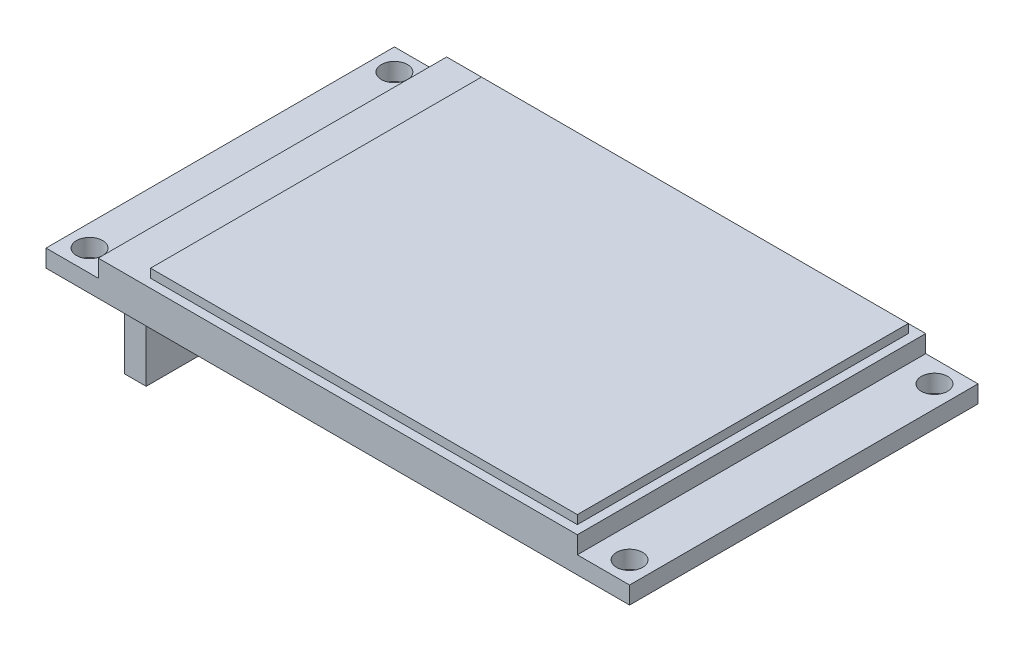
ISO-10303-21;
HEADER;
FILE_DESCRIPTION(('STEP AP214'),'2;1');
FILE_NAME('part.step','',(''),(''),'','','');
FILE_SCHEMA(('AUTOMOTIVE_DESIGN { 1 0 10303 214 1 1 1 1 }'));
ENDSEC;
DATA;
#1=APPLICATION_CONTEXT('core data for automotive mechanical design processes');
#2=APPLICATION_PROTOCOL_DEFINITION('international standard','automotive_design',2000,#1);
#3=PRODUCT_CONTEXT('',#1,'mechanical');
#4=PRODUCT('Part','Part','',(#3));
#5=PRODUCT_RELATED_PRODUCT_CATEGORY('part','',(#4));
#6=PRODUCT_DEFINITION_FORMATION('','',#4);
#7=PRODUCT_DEFINITION_CONTEXT('part definition',#1,'design');
#8=PRODUCT_DEFINITION('design','',#6,#7);
#9=PRODUCT_DEFINITION_SHAPE('','',#8);
#10=(LENGTH_UNIT() NAMED_UNIT(*) SI_UNIT(.MILLI.,.METRE.));
#11=(NAMED_UNIT(*) PLANE_ANGLE_UNIT() SI_UNIT($,.RADIAN.));
#12=(NAMED_UNIT(*) SI_UNIT($,.STERADIAN.) SOLID_ANGLE_UNIT());
#13=UNCERTAINTY_MEASURE_WITH_UNIT(LENGTH_MEASURE(1.E-05),#10,'distance_accuracy_value','');
#14=(GEOMETRIC_REPRESENTATION_CONTEXT(3) GLOBAL_UNCERTAINTY_ASSIGNED_CONTEXT((#13)) GLOBAL_UNIT_ASSIGNED_CONTEXT((#10,
#11,#12)) REPRESENTATION_CONTEXT('',''));
#15=CARTESIAN_POINT('',(0.,0.,0.));
#16=DIRECTION('',(0.,0.,1.));
#17=DIRECTION('',(1.,0.,0.));
#18=AXIS2_PLACEMENT_3D('',#15,#16,#17);
#19=CARTESIAN_POINT('',(0.,4.,0.));
#20=DIRECTION('',(0.,-1.,0.));
#21=DIRECTION('',(0.,0.,-1.));
#22=AXIS2_PLACEMENT_3D('',#19,#20,#21);
#23=PLANE('',#22);
#24=DIRECTION('',(1.,0.,0.));
#25=VECTOR('',#24,1.);
#26=CARTESIAN_POINT('',(5.99999999999998,4.,0.));
#27=LINE('',#26,#25);
#28=CARTESIAN_POINT('',(5.99999999999998,4.,0.));
#29=VERTEX_POINT('',#28);
#30=CARTESIAN_POINT('',(61.,4.,0.));
#31=VERTEX_POINT('',#30);
#32=EDGE_CURVE('E263',#29,#31,#27,.T.);
#33=ORIENTED_EDGE('',*,*,#32,.T.);
#34=DIRECTION('',(0.,0.,1.));
#35=VECTOR('',#34,1.);
#36=CARTESIAN_POINT('',(61.,4.,-40.));
#37=LINE('',#36,#35);
#38=CARTESIAN_POINT('',(61.,4.,-40.));
#39=VERTEX_POINT('',#38);
#40=EDGE_CURVE('E266',#39,#31,#37,.T.);
#41=ORIENTED_EDGE('',*,*,#40,.F.);
#42=DIRECTION('',(1.,0.,0.));
#43=VECTOR('',#42,1.);
#44=CARTESIAN_POINT('',(5.99999999999997,4.,-40.));
#45=LINE('',#44,#43);
#46=CARTESIAN_POINT('',(5.99999999999997,4.,-40.));
#47=VERTEX_POINT('',#46);
#48=EDGE_CURVE('E271',#47,#39,#45,.T.);
#49=ORIENTED_EDGE('',*,*,#48,.F.);
#50=DIRECTION('',(0.,0.,1.));
#51=VECTOR('',#50,1.);
#52=CARTESIAN_POINT('',(5.99999999999997,4.,-40.));
#53=LINE('',#52,#51);
#54=EDGE_CURVE('E275',#47,#29,#53,.T.);
#55=ORIENTED_EDGE('',*,*,#54,.T.);
#56=EDGE_LOOP('',(#33,#41,#49,#55));
#57=FACE_BOUND('',#56,.T.);
#58=DIRECTION('',(0.,0.,-1.));
#59=VECTOR('',#58,1.);
#60=CARTESIAN_POINT('',(60.,4.,-0.999999999999999));
#61=LINE('',#60,#59);
#62=CARTESIAN_POINT('',(60.,4.,-0.999999999999999));
#63=VERTEX_POINT('',#62);
#64=CARTESIAN_POINT('',(60.,4.,-39.));
#65=VERTEX_POINT('',#64);
#66=EDGE_CURVE('E214',#63,#65,#61,.T.);
#67=ORIENTED_EDGE('',*,*,#66,.F.);
#68=DIRECTION('',(1.,0.,0.));
#69=VECTOR('',#68,1.);
#70=CARTESIAN_POINT('',(60.,4.,-0.999999999999999));
#71=LINE('',#70,#69);
#72=CARTESIAN_POINT('',(11.,4.,-0.999999999999994));
#73=VERTEX_POINT('',#72);
#74=EDGE_CURVE('E223',#73,#63,#71,.T.);
#75=ORIENTED_EDGE('',*,*,#74,.F.);
#76=DIRECTION('',(0.,0.,1.));
#77=VECTOR('',#76,1.);
#78=CARTESIAN_POINT('',(11.,4.,-0.999999999999994));
#79=LINE('',#78,#77);
#80=CARTESIAN_POINT('',(11.,4.,-39.));
#81=VERTEX_POINT('',#80);
#82=EDGE_CURVE('E240',#81,#73,#79,.T.);
#83=ORIENTED_EDGE('',*,*,#82,.F.);
#84=DIRECTION('',(-1.,0.,0.));
#85=VECTOR('',#84,1.);
#86=CARTESIAN_POINT('',(60.,4.,-39.));
#87=LINE('',#86,#85);
#88=EDGE_CURVE('E236',#65,#81,#87,.T.);
#89=ORIENTED_EDGE('',*,*,#88,.F.);
#90=EDGE_LOOP('',(#67,#75,#83,#89));
#91=FACE_BOUND('',#90,.T.);
#92=ADVANCED_FACE('F39',(#57,#91),#23,.F.);
#93=CARTESIAN_POINT('',(0.,2.,0.));
#94=DIRECTION('',(0.,-1.,0.));
#95=DIRECTION('',(0.,0.,-1.));
#96=AXIS2_PLACEMENT_3D('',#93,#94,#95);
#97=PLANE('',#96);
#98=CARTESIAN_POINT('',(2.49999999999997,2.,-2.5));
#99=DIRECTION('',(0.,1.,0.));
#100=DIRECTION('',(0.,0.,1.));
#101=AXIS2_PLACEMENT_3D('',#98,#99,#100);
#102=CIRCLE('',#101,1.5);
#103=CARTESIAN_POINT('',(2.49999999999997,2.,-1.));
#104=VERTEX_POINT('',#103);
#105=EDGE_CURVE('E202',#104,#104,#102,.T.);
#106=ORIENTED_EDGE('',*,*,#105,.F.);
#107=EDGE_LOOP('',(#106));
#108=FACE_BOUND('',#107,.T.);
#109=CARTESIAN_POINT('',(2.49999999999997,2.,-37.5));
#110=DIRECTION('',(0.,1.,0.));
#111=DIRECTION('',(0.,0.,1.));
#112=AXIS2_PLACEMENT_3D('',#109,#110,#111);
#113=CIRCLE('',#112,1.5);
#114=CARTESIAN_POINT('',(2.49999999999997,2.,-36.));
#115=VERTEX_POINT('',#114);
#116=EDGE_CURVE('E210',#115,#115,#113,.T.);
#117=ORIENTED_EDGE('',*,*,#116,.F.);
#118=EDGE_LOOP('',(#117));
#119=FACE_BOUND('',#118,.T.);
#120=DIRECTION('',(0.,0.,1.));
#121=VECTOR('',#120,1.);
#122=CARTESIAN_POINT('',(5.99999999999997,2.,-40.));
#123=LINE('',#122,#121);
#124=CARTESIAN_POINT('',(5.99999999999997,2.,-40.));
#125=VERTEX_POINT('',#124);
#126=CARTESIAN_POINT('',(5.99999999999998,2.,0.));
#127=VERTEX_POINT('',#126);
#128=EDGE_CURVE('E267',#125,#127,#123,.T.);
#129=ORIENTED_EDGE('',*,*,#128,.F.);
#130=DIRECTION('',(-1.,0.,0.));
#131=VECTOR('',#130,1.);
#132=CARTESIAN_POINT('',(0.,2.,-40.));
#133=LINE('',#132,#131);
#134=CARTESIAN_POINT('',(0.,2.,-40.));
#135=VERTEX_POINT('',#134);
#136=EDGE_CURVE('E309',#125,#135,#133,.T.);
#137=ORIENTED_EDGE('',*,*,#136,.T.);
#138=DIRECTION('',(0.,0.,1.));
#139=VECTOR('',#138,1.);
#140=CARTESIAN_POINT('',(0.,2.,0.));
#141=LINE('',#140,#139);
#142=CARTESIAN_POINT('',(0.,2.,0.));
#143=VERTEX_POINT('',#142);
#144=EDGE_CURVE('E296',#135,#143,#141,.T.);
#145=ORIENTED_EDGE('',*,*,#144,.T.);
#146=DIRECTION('',(1.,0.,0.));
#147=VECTOR('',#146,1.);
#148=CARTESIAN_POINT('',(0.,2.,0.));
#149=LINE('',#148,#147);
#150=EDGE_CURVE('E302',#143,#127,#149,.T.);
#151=ORIENTED_EDGE('',*,*,#150,.T.);
#152=EDGE_LOOP('',(#129,#137,#145,#151));
#153=FACE_BOUND('',#152,.T.);
#154=ADVANCED_FACE('F352',(#108,#119,#153),#97,.F.);
#155=CARTESIAN_POINT('',(0.,2.,0.));
#156=DIRECTION('',(1.,0.,0.));
#157=DIRECTION('',(0.,0.,-1.));
#158=AXIS2_PLACEMENT_3D('',#155,#156,#157);
#159=PLANE('',#158);
#160=DIRECTION('',(0.,0.,1.));
#161=VECTOR('',#160,1.);
#162=CARTESIAN_POINT('',(0.,0.,0.));
#163=LINE('',#162,#161);
#164=CARTESIAN_POINT('',(0.,0.,-40.));
#165=VERTEX_POINT('',#164);
#166=CARTESIAN_POINT('',(0.,0.,-34.));
#167=VERTEX_POINT('',#166);
#168=EDGE_CURVE('E177',#165,#167,#163,.T.);
#169=ORIENTED_EDGE('',*,*,#168,.T.);
#170=DIRECTION('',(0.,1.,0.));
#171=VECTOR('',#170,1.);
#172=CARTESIAN_POINT('',(0.,-15.,-34.));
#173=LINE('',#172,#171);
#174=CARTESIAN_POINT('',(0.,-15.,-34.));
#175=VERTEX_POINT('',#174);
#176=EDGE_CURVE('E156',#175,#167,#173,.T.);
#177=ORIENTED_EDGE('',*,*,#176,.F.);
#178=DIRECTION('',(0.,0.,-1.));
#179=VECTOR('',#178,1.);
#180=CARTESIAN_POINT('',(0.,-15.,-9.));
#181=LINE('',#180,#179);
#182=CARTESIAN_POINT('',(0.,-15.,-9.));
#183=VERTEX_POINT('',#182);
#184=EDGE_CURVE('E163',#183,#175,#181,.T.);
#185=ORIENTED_EDGE('',*,*,#184,.F.);
#186=DIRECTION('',(0.,1.,0.));
#187=VECTOR('',#186,1.);
#188=CARTESIAN_POINT('',(0.,-15.,-9.));
#189=LINE('',#188,#187);
#190=CARTESIAN_POINT('',(0.,0.,-9.));
#191=VERTEX_POINT('',#190);
#192=EDGE_CURVE('E356',#183,#191,#189,.T.);
#193=ORIENTED_EDGE('',*,*,#192,.T.);
#194=CARTESIAN_POINT('',(0.,0.,0.));
#195=VERTEX_POINT('',#194);
#196=EDGE_CURVE('E60',#191,#195,#163,.T.);
#197=ORIENTED_EDGE('',*,*,#196,.T.);
#198=DIRECTION('',(0.,-1.,0.));
#199=VECTOR('',#198,1.);
#200=CARTESIAN_POINT('',(0.,2.,0.));
#201=LINE('',#200,#199);
#202=EDGE_CURVE('E11',#143,#195,#201,.T.);
#203=ORIENTED_EDGE('',*,*,#202,.F.);
#204=ORIENTED_EDGE('',*,*,#144,.F.);
#205=DIRECTION('',(0.,-1.,0.));
#206=VECTOR('',#205,1.);
#207=CARTESIAN_POINT('',(0.,2.,-40.));
#208=LINE('',#207,#206);
#209=EDGE_CURVE('E314',#135,#165,#208,.T.);
#210=ORIENTED_EDGE('',*,*,#209,.T.);
#211=EDGE_LOOP('',(#169,#177,#185,#193,#197,#203,#204,#210));
#212=FACE_BOUND('',#211,.T.);
#213=ADVANCED_FACE('F41',(#212),#159,.F.);
#214=CARTESIAN_POINT('',(0.,2.,0.));
#215=DIRECTION('',(0.,0.,-1.));
#216=DIRECTION('',(-1.,0.,0.));
#217=AXIS2_PLACEMENT_3D('',#214,#215,#216);
#218=PLANE('',#217);
#219=DIRECTION('',(1.,0.,0.));
#220=VECTOR('',#219,1.);
#221=CARTESIAN_POINT('',(0.,0.,0.));
#222=LINE('',#221,#220);
#223=CARTESIAN_POINT('',(67.,0.,0.));
#224=VERTEX_POINT('',#223);
#225=EDGE_CURVE('E317',#195,#224,#222,.T.);
#226=ORIENTED_EDGE('',*,*,#225,.T.);
#227=DIRECTION('',(0.,-1.,0.));
#228=VECTOR('',#227,1.);
#229=CARTESIAN_POINT('',(67.,2.,0.));
#230=LINE('',#229,#228);
#231=CARTESIAN_POINT('',(67.,2.,0.));
#232=VERTEX_POINT('',#231);
#233=EDGE_CURVE('E48',#232,#224,#230,.T.);
#234=ORIENTED_EDGE('',*,*,#233,.F.);
#235=CARTESIAN_POINT('',(61.,2.,0.));
#236=VERTEX_POINT('',#235);
#237=EDGE_CURVE('E300',#236,#232,#149,.T.);
#238=ORIENTED_EDGE('',*,*,#237,.F.);
#239=DIRECTION('',(0.,-1.,0.));
#240=VECTOR('',#239,1.);
#241=CARTESIAN_POINT('',(61.,4.,0.));
#242=LINE('',#241,#240);
#243=EDGE_CURVE('E293',#31,#236,#242,.T.);
#244=ORIENTED_EDGE('',*,*,#243,.F.);
#245=ORIENTED_EDGE('',*,*,#32,.F.);
#246=DIRECTION('',(0.,-1.,0.));
#247=VECTOR('',#246,1.);
#248=CARTESIAN_POINT('',(5.99999999999998,4.,0.));
#249=LINE('',#248,#247);
#250=EDGE_CURVE('E278',#29,#127,#249,.T.);
#251=ORIENTED_EDGE('',*,*,#250,.T.);
#252=ORIENTED_EDGE('',*,*,#150,.F.);
#253=ORIENTED_EDGE('',*,*,#202,.T.);
#254=EDGE_LOOP('',(#226,#234,#238,#244,#245,#251,#252,#253));
#255=FACE_BOUND('',#254,.T.);
#256=ADVANCED_FACE('F415',(#255),#218,.F.);
#257=CARTESIAN_POINT('',(67.,2.,0.));
#258=DIRECTION('',(-1.,0.,0.));
#259=DIRECTION('',(0.,0.,1.));
#260=AXIS2_PLACEMENT_3D('',#257,#258,#259);
#261=PLANE('',#260);
#262=DIRECTION('',(0.,0.,-1.));
#263=VECTOR('',#262,1.);
#264=CARTESIAN_POINT('',(67.,0.,0.));
#265=LINE('',#264,#263);
#266=CARTESIAN_POINT('',(67.,0.,-40.));
#267=VERTEX_POINT('',#266);
#268=EDGE_CURVE('E320',#224,#267,#265,.T.);
#269=ORIENTED_EDGE('',*,*,#268,.T.);
#270=DIRECTION('',(0.,-1.,0.));
#271=VECTOR('',#270,1.);
#272=CARTESIAN_POINT('',(67.,2.,-40.));
#273=LINE('',#272,#271);
#274=CARTESIAN_POINT('',(67.,2.,-40.));
#275=VERTEX_POINT('',#274);
#276=EDGE_CURVE('E327',#275,#267,#273,.T.);
#277=ORIENTED_EDGE('',*,*,#276,.F.);
#278=DIRECTION('',(0.,0.,-1.));
#279=VECTOR('',#278,1.);
#280=CARTESIAN_POINT('',(67.,2.,0.));
#281=LINE('',#280,#279);
#282=EDGE_CURVE('E306',#232,#275,#281,.T.);
#283=ORIENTED_EDGE('',*,*,#282,.F.);
#284=ORIENTED_EDGE('',*,*,#233,.T.);
#285=EDGE_LOOP('',(#269,#277,#283,#284));
#286=FACE_BOUND('',#285,.T.);
#287=ADVANCED_FACE('F336',(#286),#261,.F.);
#288=CARTESIAN_POINT('',(0.,2.,-40.));
#289=DIRECTION('',(0.,0.,1.));
#290=DIRECTION('',(1.,0.,0.));
#291=AXIS2_PLACEMENT_3D('',#288,#289,#290);
#292=PLANE('',#291);
#293=DIRECTION('',(-1.,0.,0.));
#294=VECTOR('',#293,1.);
#295=CARTESIAN_POINT('',(0.,0.,-40.));
#296=LINE('',#295,#294);
#297=EDGE_CURVE('E301',#267,#165,#296,.T.);
#298=ORIENTED_EDGE('',*,*,#297,.T.);
#299=ORIENTED_EDGE('',*,*,#209,.F.);
#300=ORIENTED_EDGE('',*,*,#136,.F.);
#301=DIRECTION('',(0.,-1.,0.));
#302=VECTOR('',#301,1.);
#303=CARTESIAN_POINT('',(5.99999999999997,4.,-40.));
#304=LINE('',#303,#302);
#305=EDGE_CURVE('E287',#47,#125,#304,.T.);
#306=ORIENTED_EDGE('',*,*,#305,.F.);
#307=ORIENTED_EDGE('',*,*,#48,.T.);
#308=DIRECTION('',(0.,-1.,0.));
#309=VECTOR('',#308,1.);
#310=CARTESIAN_POINT('',(61.,4.,-40.));
#311=LINE('',#310,#309);
#312=CARTESIAN_POINT('',(61.,2.,-40.));
#313=VERTEX_POINT('',#312);
#314=EDGE_CURVE('E290',#39,#313,#311,.T.);
#315=ORIENTED_EDGE('',*,*,#314,.T.);
#316=EDGE_CURVE('E310',#275,#313,#133,.T.);
#317=ORIENTED_EDGE('',*,*,#316,.F.);
#318=ORIENTED_EDGE('',*,*,#276,.T.);
#319=EDGE_LOOP('',(#298,#299,#300,#306,#307,#315,#317,#318));
#320=FACE_BOUND('',#319,.T.);
#321=ADVANCED_FACE('F345',(#320),#292,.F.);
#322=CARTESIAN_POINT('',(64.5,2.,-2.5));
#323=DIRECTION('',(0.,1.,0.));
#324=DIRECTION('',(0.,0.,1.));
#325=AXIS2_PLACEMENT_3D('',#322,#323,#324);
#326=CIRCLE('',#325,1.5);
#327=CARTESIAN_POINT('',(64.5,2.,-1.));
#328=VERTEX_POINT('',#327);
#329=EDGE_CURVE('E184',#328,#328,#326,.T.);
#330=ORIENTED_EDGE('',*,*,#329,.F.);
#331=EDGE_LOOP('',(#330));
#332=FACE_BOUND('',#331,.T.);
#333=CARTESIAN_POINT('',(64.5,2.,-37.5));
#334=DIRECTION('',(0.,1.,0.));
#335=DIRECTION('',(0.,0.,1.));
#336=AXIS2_PLACEMENT_3D('',#333,#334,#335);
#337=CIRCLE('',#336,1.5);
#338=CARTESIAN_POINT('',(64.5,2.,-36.));
#339=VERTEX_POINT('',#338);
#340=EDGE_CURVE('E194',#339,#339,#337,.T.);
#341=ORIENTED_EDGE('',*,*,#340,.F.);
#342=EDGE_LOOP('',(#341));
#343=FACE_BOUND('',#342,.T.);
#344=ORIENTED_EDGE('',*,*,#316,.T.);
#345=DIRECTION('',(0.,0.,1.));
#346=VECTOR('',#345,1.);
#347=CARTESIAN_POINT('',(61.,2.,-40.));
#348=LINE('',#347,#346);
#349=EDGE_CURVE('E262',#313,#236,#348,.T.);
#350=ORIENTED_EDGE('',*,*,#349,.T.);
#351=ORIENTED_EDGE('',*,*,#237,.T.);
#352=ORIENTED_EDGE('',*,*,#282,.T.);
#353=EDGE_LOOP('',(#344,#350,#351,#352));
#354=FACE_BOUND('',#353,.T.);
#355=ADVANCED_FACE('F394',(#332,#343,#354),#97,.F.);
#356=CARTESIAN_POINT('',(0.,0.,0.));
#357=DIRECTION('',(0.,-1.,0.));
#358=DIRECTION('',(0.,0.,-1.));
#359=AXIS2_PLACEMENT_3D('',#356,#357,#358);
#360=PLANE('',#359);
#361=DIRECTION('',(-1.,0.,0.));
#362=VECTOR('',#361,1.);
#363=CARTESIAN_POINT('',(0.,0.,-9.));
#364=LINE('',#363,#362);
#365=CARTESIAN_POINT('',(2.49999999999997,0.,-9.));
#366=VERTEX_POINT('',#365);
#367=EDGE_CURVE('E55',#366,#191,#364,.T.);
#368=ORIENTED_EDGE('',*,*,#367,.F.);
#369=DIRECTION('',(0.,0.,1.));
#370=VECTOR('',#369,1.);
#371=CARTESIAN_POINT('',(2.49999999999997,0.,-9.));
#372=LINE('',#371,#370);
#373=CARTESIAN_POINT('',(2.49999999999997,0.,-34.));
#374=VERTEX_POINT('',#373);
#375=EDGE_CURVE('E367',#374,#366,#372,.T.);
#376=ORIENTED_EDGE('',*,*,#375,.F.);
#377=DIRECTION('',(1.,0.,0.));
#378=VECTOR('',#377,1.);
#379=CARTESIAN_POINT('',(0.,0.,-34.));
#380=LINE('',#379,#378);
#381=EDGE_CURVE('E370',#167,#374,#380,.T.);
#382=ORIENTED_EDGE('',*,*,#381,.F.);
#383=ORIENTED_EDGE('',*,*,#168,.F.);
#384=ORIENTED_EDGE('',*,*,#297,.F.);
#385=ORIENTED_EDGE('',*,*,#268,.F.);
#386=ORIENTED_EDGE('',*,*,#225,.F.);
#387=ORIENTED_EDGE('',*,*,#196,.F.);
#388=EDGE_LOOP('',(#368,#376,#382,#383,#384,#385,#386,#387));
#389=FACE_BOUND('',#388,.T.);
#390=CARTESIAN_POINT('',(64.5,0.,-2.5));
#391=DIRECTION('',(0.,-1.,0.));
#392=DIRECTION('',(0.,0.,-1.));
#393=AXIS2_PLACEMENT_3D('',#390,#391,#392);
#394=CIRCLE('',#393,1.5);
#395=CARTESIAN_POINT('',(64.5,0.,-4.));
#396=VERTEX_POINT('',#395);
#397=EDGE_CURVE('E179',#396,#396,#394,.F.);
#398=ORIENTED_EDGE('',*,*,#397,.T.);
#399=EDGE_LOOP('',(#398));
#400=FACE_BOUND('',#399,.T.);
#401=CARTESIAN_POINT('',(64.5,0.,-37.5));
#402=DIRECTION('',(0.,-1.,0.));
#403=DIRECTION('',(0.,0.,-1.));
#404=AXIS2_PLACEMENT_3D('',#401,#402,#403);
#405=CIRCLE('',#404,1.5);
#406=CARTESIAN_POINT('',(64.5,0.,-39.));
#407=VERTEX_POINT('',#406);
#408=EDGE_CURVE('E192',#407,#407,#405,.F.);
#409=ORIENTED_EDGE('',*,*,#408,.T.);
#410=EDGE_LOOP('',(#409));
#411=FACE_BOUND('',#410,.T.);
#412=CARTESIAN_POINT('',(2.49999999999997,0.,-2.5));
#413=DIRECTION('',(0.,-1.,0.));
#414=DIRECTION('',(0.,0.,-1.));
#415=AXIS2_PLACEMENT_3D('',#412,#413,#414);
#416=CIRCLE('',#415,1.5);
#417=CARTESIAN_POINT('',(2.49999999999997,0.,-4.));
#418=VERTEX_POINT('',#417);
#419=EDGE_CURVE('E198',#418,#418,#416,.F.);
#420=ORIENTED_EDGE('',*,*,#419,.T.);
#421=EDGE_LOOP('',(#420));
#422=FACE_BOUND('',#421,.T.);
#423=CARTESIAN_POINT('',(2.49999999999997,0.,-37.5));
#424=DIRECTION('',(0.,-1.,0.));
#425=DIRECTION('',(0.,0.,-1.));
#426=AXIS2_PLACEMENT_3D('',#423,#424,#425);
#427=CIRCLE('',#426,1.5);
#428=CARTESIAN_POINT('',(2.49999999999997,0.,-39.));
#429=VERTEX_POINT('',#428);
#430=EDGE_CURVE('E206',#429,#429,#427,.F.);
#431=ORIENTED_EDGE('',*,*,#430,.T.);
#432=EDGE_LOOP('',(#431));
#433=FACE_BOUND('',#432,.T.);
#434=ADVANCED_FACE('F341',(#389,#400,#411,#422,#433),#360,.T.);
#435=CARTESIAN_POINT('',(61.,4.,-40.));
#436=DIRECTION('',(1.,0.,0.));
#437=DIRECTION('',(0.,0.,-1.));
#438=AXIS2_PLACEMENT_3D('',#435,#436,#437);
#439=PLANE('',#438);
#440=ORIENTED_EDGE('',*,*,#349,.F.);
#441=ORIENTED_EDGE('',*,*,#314,.F.);
#442=ORIENTED_EDGE('',*,*,#40,.T.);
#443=ORIENTED_EDGE('',*,*,#243,.T.);
#444=EDGE_LOOP('',(#440,#441,#442,#443));
#445=FACE_BOUND('',#444,.T.);
#446=ADVANCED_FACE('F403',(#445),#439,.T.);
#447=CARTESIAN_POINT('',(5.99999999999997,4.,-40.));
#448=DIRECTION('',(1.,0.,0.));
#449=DIRECTION('',(0.,0.,-1.));
#450=AXIS2_PLACEMENT_3D('',#447,#448,#449);
#451=PLANE('',#450);
#452=ORIENTED_EDGE('',*,*,#128,.T.);
#453=ORIENTED_EDGE('',*,*,#250,.F.);
#454=ORIENTED_EDGE('',*,*,#54,.F.);
#455=ORIENTED_EDGE('',*,*,#305,.T.);
#456=EDGE_LOOP('',(#452,#453,#454,#455));
#457=FACE_BOUND('',#456,.T.);
#458=ADVANCED_FACE('F400',(#457),#451,.F.);
#459=CARTESIAN_POINT('',(60.,5.,-0.999999999999999));
#460=DIRECTION('',(-1.,0.,0.));
#461=DIRECTION('',(0.,0.,1.));
#462=AXIS2_PLACEMENT_3D('',#459,#460,#461);
#463=PLANE('',#462);
#464=ORIENTED_EDGE('',*,*,#66,.T.);
#465=DIRECTION('',(0.,-1.,0.));
#466=VECTOR('',#465,1.);
#467=CARTESIAN_POINT('',(60.,5.,-39.));
#468=LINE('',#467,#466);
#469=CARTESIAN_POINT('',(60.,5.,-39.));
#470=VERTEX_POINT('',#469);
#471=EDGE_CURVE('E258',#470,#65,#468,.T.);
#472=ORIENTED_EDGE('',*,*,#471,.F.);
#473=DIRECTION('',(0.,0.,-1.));
#474=VECTOR('',#473,1.);
#475=CARTESIAN_POINT('',(60.,5.,-0.999999999999999));
#476=LINE('',#475,#474);
#477=CARTESIAN_POINT('',(60.,5.,-0.999999999999999));
#478=VERTEX_POINT('',#477);
#479=EDGE_CURVE('E218',#478,#470,#476,.T.);
#480=ORIENTED_EDGE('',*,*,#479,.F.);
#481=DIRECTION('',(0.,-1.,0.));
#482=VECTOR('',#481,1.);
#483=CARTESIAN_POINT('',(60.,5.,-0.999999999999999));
#484=LINE('',#483,#482);
#485=EDGE_CURVE('E232',#478,#63,#484,.T.);
#486=ORIENTED_EDGE('',*,*,#485,.T.);
#487=EDGE_LOOP('',(#464,#472,#480,#486));
#488=FACE_BOUND('',#487,.T.);
#489=ADVANCED_FACE('F398',(#488),#463,.F.);
#490=CARTESIAN_POINT('',(60.,5.,-39.));
#491=DIRECTION('',(0.,0.,1.));
#492=DIRECTION('',(1.,0.,0.));
#493=AXIS2_PLACEMENT_3D('',#490,#491,#492);
#494=PLANE('',#493);
#495=ORIENTED_EDGE('',*,*,#88,.T.);
#496=DIRECTION('',(0.,-1.,0.));
#497=VECTOR('',#496,1.);
#498=CARTESIAN_POINT('',(11.,5.,-39.));
#499=LINE('',#498,#497);
#500=CARTESIAN_POINT('',(11.,5.,-39.));
#501=VERTEX_POINT('',#500);
#502=EDGE_CURVE('E254',#501,#81,#499,.T.);
#503=ORIENTED_EDGE('',*,*,#502,.F.);
#504=DIRECTION('',(-1.,0.,0.));
#505=VECTOR('',#504,1.);
#506=CARTESIAN_POINT('',(60.,5.,-39.));
#507=LINE('',#506,#505);
#508=EDGE_CURVE('E222',#470,#501,#507,.T.);
#509=ORIENTED_EDGE('',*,*,#508,.F.);
#510=ORIENTED_EDGE('',*,*,#471,.T.);
#511=EDGE_LOOP('',(#495,#503,#509,#510));
#512=FACE_BOUND('',#511,.T.);
#513=ADVANCED_FACE('F526',(#512),#494,.F.);
#514=CARTESIAN_POINT('',(11.,5.,-0.999999999999994));
#515=DIRECTION('',(1.,0.,0.));
#516=DIRECTION('',(0.,0.,-1.));
#517=AXIS2_PLACEMENT_3D('',#514,#515,#516);
#518=PLANE('',#517);
#519=ORIENTED_EDGE('',*,*,#82,.T.);
#520=DIRECTION('',(0.,-1.,0.));
#521=VECTOR('',#520,1.);
#522=CARTESIAN_POINT('',(11.,5.,-0.999999999999994));
#523=LINE('',#522,#521);
#524=CARTESIAN_POINT('',(11.,5.,-0.999999999999994));
#525=VERTEX_POINT('',#524);
#526=EDGE_CURVE('E250',#525,#73,#523,.T.);
#527=ORIENTED_EDGE('',*,*,#526,.F.);
#528=DIRECTION('',(0.,0.,1.));
#529=VECTOR('',#528,1.);
#530=CARTESIAN_POINT('',(11.,5.,-0.999999999999994));
#531=LINE('',#530,#529);
#532=EDGE_CURVE('E226',#501,#525,#531,.T.);
#533=ORIENTED_EDGE('',*,*,#532,.F.);
#534=ORIENTED_EDGE('',*,*,#502,.T.);
#535=EDGE_LOOP('',(#519,#527,#533,#534));
#536=FACE_BOUND('',#535,.T.);
#537=ADVANCED_FACE('F517',(#536),#518,.F.);
#538=CARTESIAN_POINT('',(60.,5.,-0.999999999999999));
#539=DIRECTION('',(0.,0.,-1.));
#540=DIRECTION('',(-1.,0.,0.));
#541=AXIS2_PLACEMENT_3D('',#538,#539,#540);
#542=PLANE('',#541);
#543=ORIENTED_EDGE('',*,*,#74,.T.);
#544=ORIENTED_EDGE('',*,*,#485,.F.);
#545=DIRECTION('',(1.,0.,0.));
#546=VECTOR('',#545,1.);
#547=CARTESIAN_POINT('',(60.,5.,-0.999999999999999));
#548=LINE('',#547,#546);
#549=EDGE_CURVE('E229',#525,#478,#548,.T.);
#550=ORIENTED_EDGE('',*,*,#549,.F.);
#551=ORIENTED_EDGE('',*,*,#526,.T.);
#552=EDGE_LOOP('',(#543,#544,#550,#551));
#553=FACE_BOUND('',#552,.T.);
#554=ADVANCED_FACE('F508',(#553),#542,.F.);
#555=CARTESIAN_POINT('',(0.,5.,0.));
#556=DIRECTION('',(0.,1.,0.));
#557=DIRECTION('',(0.,0.,1.));
#558=AXIS2_PLACEMENT_3D('',#555,#556,#557);
#559=PLANE('',#558);
#560=ORIENTED_EDGE('',*,*,#479,.T.);
#561=ORIENTED_EDGE('',*,*,#508,.T.);
#562=ORIENTED_EDGE('',*,*,#532,.T.);
#563=ORIENTED_EDGE('',*,*,#549,.T.);
#564=EDGE_LOOP('',(#560,#561,#562,#563));
#565=FACE_BOUND('',#564,.T.);
#566=ADVANCED_FACE('F499',(#565),#559,.T.);
#567=CARTESIAN_POINT('',(2.49999999999997,-0.00100000000000013,-37.5));
#568=DIRECTION('',(0.,1.,0.));
#569=DIRECTION('',(0.,0.,1.));
#570=AXIS2_PLACEMENT_3D('',#567,#568,#569);
#571=CYLINDRICAL_SURFACE('',#570,1.5);
#572=ORIENTED_EDGE('',*,*,#430,.F.);
#573=EDGE_LOOP('',(#572));
#574=FACE_BOUND('',#573,.T.);
#575=ORIENTED_EDGE('',*,*,#116,.T.);
#576=EDGE_LOOP('',(#575));
#577=FACE_BOUND('',#576,.T.);
#578=ADVANCED_FACE('F489',(#574,#577),#571,.F.);
#579=CARTESIAN_POINT('',(2.49999999999997,-0.00100000000000013,-2.5));
#580=DIRECTION('',(0.,1.,0.));
#581=DIRECTION('',(0.,0.,1.));
#582=AXIS2_PLACEMENT_3D('',#579,#580,#581);
#583=CYLINDRICAL_SURFACE('',#582,1.5);
#584=ORIENTED_EDGE('',*,*,#419,.F.);
#585=EDGE_LOOP('',(#584));
#586=FACE_BOUND('',#585,.T.);
#587=ORIENTED_EDGE('',*,*,#105,.T.);
#588=EDGE_LOOP('',(#587));
#589=FACE_BOUND('',#588,.T.);
#590=ADVANCED_FACE('F480',(#586,#589),#583,.F.);
#591=CARTESIAN_POINT('',(64.5,-0.00100000000000013,-37.5));
#592=DIRECTION('',(0.,1.,0.));
#593=DIRECTION('',(0.,0.,1.));
#594=AXIS2_PLACEMENT_3D('',#591,#592,#593);
#595=CYLINDRICAL_SURFACE('',#594,1.5);
#596=ORIENTED_EDGE('',*,*,#408,.F.);
#597=EDGE_LOOP('',(#596));
#598=FACE_BOUND('',#597,.T.);
#599=ORIENTED_EDGE('',*,*,#340,.T.);
#600=EDGE_LOOP('',(#599));
#601=FACE_BOUND('',#600,.T.);
#602=ADVANCED_FACE('F471',(#598,#601),#595,.F.);
#603=CARTESIAN_POINT('',(64.5,-0.00100000000000013,-2.5));
#604=DIRECTION('',(0.,1.,0.));
#605=DIRECTION('',(0.,0.,1.));
#606=AXIS2_PLACEMENT_3D('',#603,#604,#605);
#607=CYLINDRICAL_SURFACE('',#606,1.5);
#608=ORIENTED_EDGE('',*,*,#397,.F.);
#609=EDGE_LOOP('',(#608));
#610=FACE_BOUND('',#609,.T.);
#611=ORIENTED_EDGE('',*,*,#329,.T.);
#612=EDGE_LOOP('',(#611));
#613=FACE_BOUND('',#612,.T.);
#614=ADVANCED_FACE('F435',(#610,#613),#607,.F.);
#615=CARTESIAN_POINT('',(0.,-15.,-34.));
#616=DIRECTION('',(0.,0.,1.));
#617=DIRECTION('',(1.,0.,0.));
#618=AXIS2_PLACEMENT_3D('',#615,#616,#617);
#619=PLANE('',#618);
#620=ORIENTED_EDGE('',*,*,#381,.T.);
#621=DIRECTION('',(0.,1.,0.));
#622=VECTOR('',#621,1.);
#623=CARTESIAN_POINT('',(2.49999999999997,-15.,-34.));
#624=LINE('',#623,#622);
#625=CARTESIAN_POINT('',(2.49999999999997,-15.,-34.));
#626=VERTEX_POINT('',#625);
#627=EDGE_CURVE('E158',#626,#374,#624,.T.);
#628=ORIENTED_EDGE('',*,*,#627,.F.);
#629=DIRECTION('',(1.,0.,0.));
#630=VECTOR('',#629,1.);
#631=CARTESIAN_POINT('',(0.,-15.,-34.));
#632=LINE('',#631,#630);
#633=EDGE_CURVE('E151',#175,#626,#632,.T.);
#634=ORIENTED_EDGE('',*,*,#633,.F.);
#635=ORIENTED_EDGE('',*,*,#176,.T.);
#636=EDGE_LOOP('',(#620,#628,#634,#635));
#637=FACE_BOUND('',#636,.T.);
#638=ADVANCED_FACE('F154',(#637),#619,.F.);
#639=CARTESIAN_POINT('',(2.49999999999997,-15.,-9.));
#640=DIRECTION('',(-1.,0.,0.));
#641=DIRECTION('',(0.,0.,1.));
#642=AXIS2_PLACEMENT_3D('',#639,#640,#641);
#643=PLANE('',#642);
#644=ORIENTED_EDGE('',*,*,#375,.T.);
#645=DIRECTION('',(0.,1.,0.));
#646=VECTOR('',#645,1.);
#647=CARTESIAN_POINT('',(2.49999999999997,-15.,-9.));
#648=LINE('',#647,#646);
#649=CARTESIAN_POINT('',(2.49999999999997,-15.,-9.));
#650=VERTEX_POINT('',#649);
#651=EDGE_CURVE('E186',#650,#366,#648,.T.);
#652=ORIENTED_EDGE('',*,*,#651,.F.);
#653=DIRECTION('',(0.,0.,1.));
#654=VECTOR('',#653,1.);
#655=CARTESIAN_POINT('',(2.49999999999997,-15.,-9.));
#656=LINE('',#655,#654);
#657=EDGE_CURVE('E162',#626,#650,#656,.T.);
#658=ORIENTED_EDGE('',*,*,#657,.F.);
#659=ORIENTED_EDGE('',*,*,#627,.T.);
#660=EDGE_LOOP('',(#644,#652,#658,#659));
#661=FACE_BOUND('',#660,.T.);
#662=ADVANCED_FACE('F376',(#661),#643,.F.);
#663=CARTESIAN_POINT('',(0.,-15.,-9.));
#664=DIRECTION('',(0.,0.,-1.));
#665=DIRECTION('',(-1.,0.,0.));
#666=AXIS2_PLACEMENT_3D('',#663,#664,#665);
#667=PLANE('',#666);
#668=ORIENTED_EDGE('',*,*,#367,.T.);
#669=ORIENTED_EDGE('',*,*,#192,.F.);
#670=DIRECTION('',(-1.,0.,0.));
#671=VECTOR('',#670,1.);
#672=CARTESIAN_POINT('',(0.,-15.,-9.));
#673=LINE('',#672,#671);
#674=EDGE_CURVE('E168',#650,#183,#673,.T.);
#675=ORIENTED_EDGE('',*,*,#674,.F.);
#676=ORIENTED_EDGE('',*,*,#651,.T.);
#677=EDGE_LOOP('',(#668,#669,#675,#676));
#678=FACE_BOUND('',#677,.T.);
#679=ADVANCED_FACE('F377',(#678),#667,.F.);
#680=CARTESIAN_POINT('',(0.,-15.,0.));
#681=DIRECTION('',(0.,-1.,0.));
#682=DIRECTION('',(0.,0.,-1.));
#683=AXIS2_PLACEMENT_3D('',#680,#681,#682);
#684=PLANE('',#683);
#685=ORIENTED_EDGE('',*,*,#184,.T.);
#686=ORIENTED_EDGE('',*,*,#633,.T.);
#687=ORIENTED_EDGE('',*,*,#657,.T.);
#688=ORIENTED_EDGE('',*,*,#674,.T.);
#689=EDGE_LOOP('',(#685,#686,#687,#688));
#690=FACE_BOUND('',#689,.T.);
#691=ADVANCED_FACE('F166',(#690),#684,.T.);
#692=CLOSED_SHELL('',(#92,#154,#213,#256,#287,#321,#355,#434,#446,#458,#489,#513,#537,#554,#566,
#578,#590,#602,#614,#638,#662,#679,#691));
#693=MANIFOLD_SOLID_BREP('B2',#692);
#694=ADVANCED_BREP_SHAPE_REPRESENTATION('',(#18,#693),#14);
#695=SHAPE_DEFINITION_REPRESENTATION(#9,#694);
ENDSEC;
END-ISO-10303-21;
